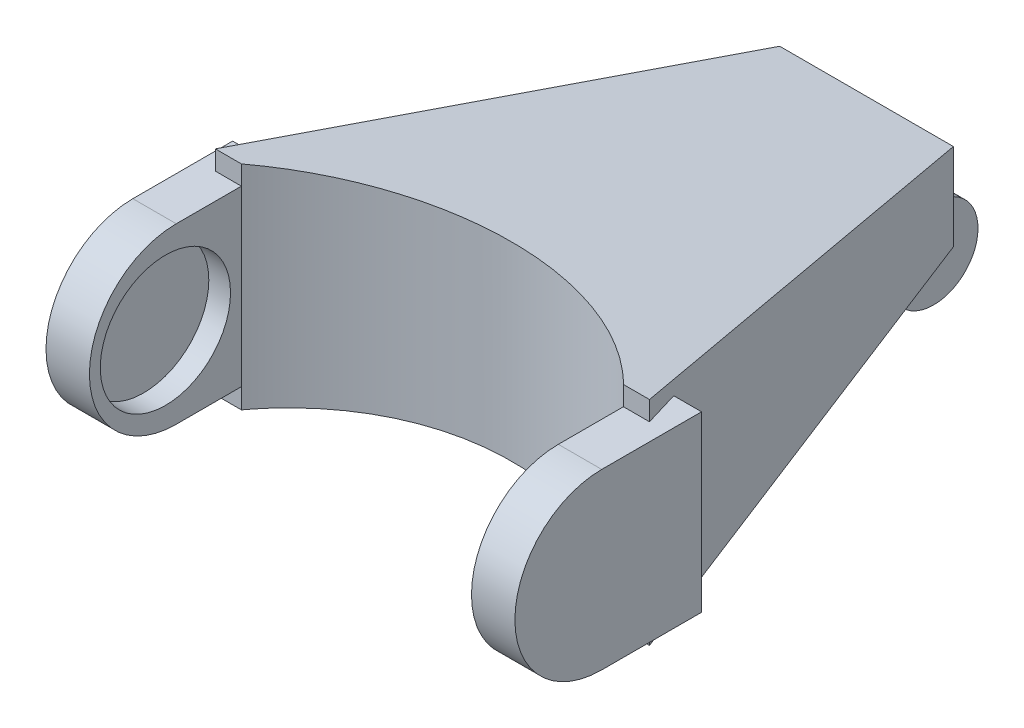
ISO-10303-21;
HEADER;
FILE_DESCRIPTION(('STEP AP214'),'2;1');
FILE_NAME('part.step','',(''),(''),'','','');
FILE_SCHEMA(('AUTOMOTIVE_DESIGN { 1 0 10303 214 1 1 1 1 }'));
ENDSEC;
DATA;
#1=APPLICATION_CONTEXT('core data for automotive mechanical design processes');
#2=APPLICATION_PROTOCOL_DEFINITION('international standard','automotive_design',2000,#1);
#3=PRODUCT_CONTEXT('',#1,'mechanical');
#4=PRODUCT('Part','Part','',(#3));
#5=PRODUCT_RELATED_PRODUCT_CATEGORY('part','',(#4));
#6=PRODUCT_DEFINITION_FORMATION('','',#4);
#7=PRODUCT_DEFINITION_CONTEXT('part definition',#1,'design');
#8=PRODUCT_DEFINITION('design','',#6,#7);
#9=PRODUCT_DEFINITION_SHAPE('','',#8);
#10=(LENGTH_UNIT() NAMED_UNIT(*) SI_UNIT(.MILLI.,.METRE.));
#11=(NAMED_UNIT(*) PLANE_ANGLE_UNIT() SI_UNIT($,.RADIAN.));
#12=(NAMED_UNIT(*) SI_UNIT($,.STERADIAN.) SOLID_ANGLE_UNIT());
#13=UNCERTAINTY_MEASURE_WITH_UNIT(LENGTH_MEASURE(1.E-05),#10,'distance_accuracy_value','');
#14=(GEOMETRIC_REPRESENTATION_CONTEXT(3) GLOBAL_UNCERTAINTY_ASSIGNED_CONTEXT((#13)) GLOBAL_UNIT_ASSIGNED_CONTEXT((#10,
#11,#12)) REPRESENTATION_CONTEXT('',''));
#15=CARTESIAN_POINT('',(0.,0.,0.));
#16=DIRECTION('',(0.,0.,1.));
#17=DIRECTION('',(1.,0.,0.));
#18=AXIS2_PLACEMENT_3D('',#15,#16,#17);
#19=CARTESIAN_POINT('',(-25.,30.,-10.));
#20=DIRECTION('',(0.,0.,-1.));
#21=DIRECTION('',(-1.,0.,0.));
#22=AXIS2_PLACEMENT_3D('',#19,#20,#21);
#23=PLANE('',#22);
#24=DIRECTION('',(0.,1.,0.));
#25=VECTOR('',#24,1.);
#26=CARTESIAN_POINT('',(22.,0.26731497007778,-9.99999999999983));
#27=LINE('',#26,#25);
#28=CARTESIAN_POINT('',(22.,25.0467731044899,-9.99999999999983));
#29=VERTEX_POINT('',#28);
#30=CARTESIAN_POINT('',(22.,27.2673149700778,-9.99999999999983));
#31=VERTEX_POINT('',#30);
#32=EDGE_CURVE('E326',#29,#31,#27,.T.);
#33=ORIENTED_EDGE('',*,*,#32,.F.);
#34=DIRECTION('',(1.,0.,0.));
#35=VECTOR('',#34,1.);
#36=CARTESIAN_POINT('',(-25.,25.0467731044898,-10.));
#37=LINE('',#36,#35);
#38=CARTESIAN_POINT('',(25.,25.0467731044899,-10.));
#39=VERTEX_POINT('',#38);
#40=EDGE_CURVE('E219',#29,#39,#37,.T.);
#41=ORIENTED_EDGE('',*,*,#40,.T.);
#42=DIRECTION('',(0.,-1.,0.));
#43=VECTOR('',#42,1.);
#44=CARTESIAN_POINT('',(25.,30.,-10.));
#45=LINE('',#44,#43);
#46=CARTESIAN_POINT('',(25.,27.2673149700778,-9.99999999999982));
#47=VERTEX_POINT('',#46);
#48=EDGE_CURVE('E360',#47,#39,#45,.T.);
#49=ORIENTED_EDGE('',*,*,#48,.F.);
#50=DIRECTION('',(-1.,0.,0.));
#51=VECTOR('',#50,1.);
#52=CARTESIAN_POINT('',(25.,27.2673149700778,-9.99999999999982));
#53=LINE('',#52,#51);
#54=EDGE_CURVE('E334',#47,#31,#53,.T.);
#55=ORIENTED_EDGE('',*,*,#54,.T.);
#56=EDGE_LOOP('',(#33,#41,#49,#55));
#57=FACE_BOUND('',#56,.T.);
#58=ADVANCED_FACE('F42',(#57),#23,.F.);
#59=DIRECTION('',(1.,0.,0.));
#60=VECTOR('',#59,1.);
#61=CARTESIAN_POINT('',(-25.,5.04677310448987,-10.));
#62=LINE('',#61,#60);
#63=CARTESIAN_POINT('',(-25.,5.04677310448987,-10.));
#64=VERTEX_POINT('',#63);
#65=CARTESIAN_POINT('',(-22.,5.04677310448986,-9.99999999999999));
#66=VERTEX_POINT('',#65);
#67=EDGE_CURVE('E297',#64,#66,#62,.T.);
#68=ORIENTED_EDGE('',*,*,#67,.F.);
#69=DIRECTION('',(0.,-1.,0.));
#70=VECTOR('',#69,1.);
#71=CARTESIAN_POINT('',(-25.,30.,-10.));
#72=LINE('',#71,#70);
#73=CARTESIAN_POINT('',(-25.,2.73268502992221,-10.));
#74=VERTEX_POINT('',#73);
#75=EDGE_CURVE('E349',#64,#74,#72,.T.);
#76=ORIENTED_EDGE('',*,*,#75,.T.);
#77=DIRECTION('',(-1.,0.,0.));
#78=VECTOR('',#77,1.);
#79=CARTESIAN_POINT('',(25.,2.73268502992221,-9.99999999999982));
#80=LINE('',#79,#78);
#81=CARTESIAN_POINT('',(-22.,2.73268502992221,-9.99999999999999));
#82=VERTEX_POINT('',#81);
#83=EDGE_CURVE('E333',#82,#74,#80,.T.);
#84=ORIENTED_EDGE('',*,*,#83,.F.);
#85=DIRECTION('',(0.,1.,0.));
#86=VECTOR('',#85,1.);
#87=CARTESIAN_POINT('',(-22.,0.26731497007778,-9.99999999999999));
#88=LINE('',#87,#86);
#89=EDGE_CURVE('E327',#82,#66,#88,.T.);
#90=ORIENTED_EDGE('',*,*,#89,.T.);
#91=EDGE_LOOP('',(#68,#76,#84,#90));
#92=FACE_BOUND('',#91,.T.);
#93=ADVANCED_FACE('F457',(#92),#23,.F.);
#94=DIRECTION('',(-1.,0.,0.));
#95=VECTOR('',#94,1.);
#96=CARTESIAN_POINT('',(-25.,25.0467731044899,-10.));
#97=LINE('',#96,#95);
#98=CARTESIAN_POINT('',(-22.,25.0467731044899,-9.99999999999999));
#99=VERTEX_POINT('',#98);
#100=CARTESIAN_POINT('',(-25.,25.0467731044899,-10.));
#101=VERTEX_POINT('',#100);
#102=EDGE_CURVE('E293',#99,#101,#97,.T.);
#103=ORIENTED_EDGE('',*,*,#102,.F.);
#104=CARTESIAN_POINT('',(-22.,27.2673149700778,-9.99999999999999));
#105=VERTEX_POINT('',#104);
#106=EDGE_CURVE('E320',#99,#105,#88,.T.);
#107=ORIENTED_EDGE('',*,*,#106,.T.);
#108=CARTESIAN_POINT('',(-25.,27.2673149700778,-10.));
#109=VERTEX_POINT('',#108);
#110=EDGE_CURVE('E338',#105,#109,#53,.T.);
#111=ORIENTED_EDGE('',*,*,#110,.T.);
#112=EDGE_CURVE('E350',#109,#101,#72,.T.);
#113=ORIENTED_EDGE('',*,*,#112,.T.);
#114=EDGE_LOOP('',(#103,#107,#111,#113));
#115=FACE_BOUND('',#114,.T.);
#116=ADVANCED_FACE('F423',(#115),#23,.F.);
#117=CARTESIAN_POINT('',(-10.,30.,-60.));
#118=DIRECTION('',(0.957826285221151,0.,0.287347885566346));
#119=DIRECTION('',(0.287347885566346,0.,-0.957826285221151));
#120=AXIS2_PLACEMENT_3D('',#117,#118,#119);
#121=PLANE('',#120);
#122=DIRECTION('',(-0.287347885566346,0.,0.957826285221151));
#123=VECTOR('',#122,1.);
#124=CARTESIAN_POINT('',(-10.,5.04677310448988,-60.));
#125=LINE('',#124,#123);
#126=CARTESIAN_POINT('',(-23.8020728035436,5.04677310448987,-13.9930906548547));
#127=VERTEX_POINT('',#126);
#128=EDGE_CURVE('E66',#127,#64,#125,.T.);
#129=ORIENTED_EDGE('',*,*,#128,.F.);
#130=DIRECTION('',(0.,-1.,0.));
#131=VECTOR('',#130,1.);
#132=CARTESIAN_POINT('',(-23.8020728035436,30.,-13.9930906548547));
#133=LINE('',#132,#131);
#134=CARTESIAN_POINT('',(-23.8020728035436,25.0467731044899,-13.9930906548547));
#135=VERTEX_POINT('',#134);
#136=EDGE_CURVE('E51',#135,#127,#133,.T.);
#137=ORIENTED_EDGE('',*,*,#136,.F.);
#138=DIRECTION('',(0.287347885566346,0.,-0.957826285221151));
#139=VECTOR('',#138,1.);
#140=CARTESIAN_POINT('',(-10.,25.0467731044898,-60.));
#141=LINE('',#140,#139);
#142=EDGE_CURVE('E290',#101,#135,#141,.T.);
#143=ORIENTED_EDGE('',*,*,#142,.F.);
#144=ORIENTED_EDGE('',*,*,#112,.F.);
#145=DIRECTION('',(0.28460314062852,-0.137886710961386,-0.948677135428399));
#146=VECTOR('',#145,1.);
#147=CARTESIAN_POINT('',(-10.3924299099055,20.1901274505975,-58.6919003003151));
#148=LINE('',#147,#146);
#149=CARTESIAN_POINT('',(-10.,20.,-60.));
#150=VERTEX_POINT('',#149);
#151=EDGE_CURVE('E366',#109,#150,#148,.T.);
#152=ORIENTED_EDGE('',*,*,#151,.T.);
#153=DIRECTION('',(0.,-1.,0.));
#154=VECTOR('',#153,1.);
#155=CARTESIAN_POINT('',(-10.,30.,-60.));
#156=LINE('',#155,#154);
#157=CARTESIAN_POINT('',(-10.,15.,-60.));
#158=VERTEX_POINT('',#157);
#159=EDGE_CURVE('E353',#150,#158,#156,.T.);
#160=ORIENTED_EDGE('',*,*,#159,.T.);
#161=DIRECTION('',(0.,-1.,0.));
#162=VECTOR('',#161,1.);
#163=CARTESIAN_POINT('',(-10.,15.,-60.));
#164=LINE('',#163,#162);
#165=CARTESIAN_POINT('',(-9.99999999999999,10.,-60.));
#166=VERTEX_POINT('',#165);
#167=EDGE_CURVE('E300',#158,#166,#164,.T.);
#168=ORIENTED_EDGE('',*,*,#167,.T.);
#169=DIRECTION('',(-0.28460314062852,-0.137886710961386,0.9486771354284));
#170=VECTOR('',#169,1.);
#171=CARTESIAN_POINT('',(-9.21514018018905,10.380254901195,-62.6161993993698));
#172=LINE('',#171,#170);
#173=EDGE_CURVE('E363',#166,#74,#172,.T.);
#174=ORIENTED_EDGE('',*,*,#173,.T.);
#175=ORIENTED_EDGE('',*,*,#75,.F.);
#176=EDGE_LOOP('',(#129,#137,#143,#144,#152,#160,#168,#174,#175));
#177=FACE_BOUND('',#176,.T.);
#178=ADVANCED_FACE('F421',(#177),#121,.F.);
#179=CARTESIAN_POINT('',(-10.,30.,-60.));
#180=DIRECTION('',(0.,0.,1.));
#181=DIRECTION('',(1.,0.,0.));
#182=AXIS2_PLACEMENT_3D('',#179,#180,#181);
#183=PLANE('',#182);
#184=DIRECTION('',(-1.,0.,0.));
#185=VECTOR('',#184,1.);
#186=CARTESIAN_POINT('',(10.,15.,-59.9999999999999));
#187=LINE('',#186,#185);
#188=CARTESIAN_POINT('',(10.,15.,-59.9999999999999));
#189=VERTEX_POINT('',#188);
#190=EDGE_CURVE('E308',#189,#158,#187,.T.);
#191=ORIENTED_EDGE('',*,*,#190,.T.);
#192=ORIENTED_EDGE('',*,*,#159,.F.);
#193=DIRECTION('',(-1.,0.,0.));
#194=VECTOR('',#193,1.);
#195=CARTESIAN_POINT('',(25.0000000000002,20.,-59.9999999999999));
#196=LINE('',#195,#194);
#197=CARTESIAN_POINT('',(10.,20.,-59.9999999999999));
#198=VERTEX_POINT('',#197);
#199=EDGE_CURVE('E339',#198,#150,#196,.T.);
#200=ORIENTED_EDGE('',*,*,#199,.F.);
#201=DIRECTION('',(0.,-1.,0.));
#202=VECTOR('',#201,1.);
#203=CARTESIAN_POINT('',(10.,30.,-60.));
#204=LINE('',#203,#202);
#205=EDGE_CURVE('E356',#198,#189,#204,.T.);
#206=ORIENTED_EDGE('',*,*,#205,.T.);
#207=EDGE_LOOP('',(#191,#192,#200,#206));
#208=FACE_BOUND('',#207,.T.);
#209=ADVANCED_FACE('F433',(#208),#183,.F.);
#210=CARTESIAN_POINT('',(25.0000000000002,10.,-59.9999999999999));
#211=DIRECTION('',(0.,0.989601692063751,0.143834943822984));
#212=DIRECTION('',(0.,-0.143834943822984,0.989601692063751));
#213=AXIS2_PLACEMENT_3D('',#210,#211,#212);
#214=PLANE('',#213);
#215=DIRECTION('',(0.,-0.143834943822984,0.989601692063751));
#216=VECTOR('',#215,1.);
#217=CARTESIAN_POINT('',(10.,10.,-59.9999999999999));
#218=LINE('',#217,#216);
#219=CARTESIAN_POINT('',(10.,10.,-59.9999999999999));
#220=VERTEX_POINT('',#219);
#221=CARTESIAN_POINT('',(9.99999999999998,8.96081172504753,-52.8502598330249));
#222=VERTEX_POINT('',#221);
#223=EDGE_CURVE('E303',#220,#222,#218,.T.);
#224=ORIENTED_EDGE('',*,*,#223,.F.);
#225=DIRECTION('',(-0.28460314062852,0.137886710961386,-0.9486771354284));
#226=VECTOR('',#225,1.);
#227=CARTESIAN_POINT('',(9.21514018018905,10.380254901195,-62.6161993993698));
#228=LINE('',#227,#226);
#229=CARTESIAN_POINT('',(25.,2.73268502992221,-9.99999999999982));
#230=VERTEX_POINT('',#229);
#231=EDGE_CURVE('E337',#230,#220,#228,.T.);
#232=ORIENTED_EDGE('',*,*,#231,.F.);
#233=CARTESIAN_POINT('',(22.,2.73268502992221,-9.99999999999983));
#234=VERTEX_POINT('',#233);
#235=EDGE_CURVE('E341',#230,#234,#80,.T.);
#236=ORIENTED_EDGE('',*,*,#235,.T.);
#237=CARTESIAN_POINT('',(0.,-0.46493355691203,12.0000000000002));
#238=DIRECTION('',(0.,0.989601692063751,0.143834943822984));
#239=DIRECTION('',(0.,0.143834943822984,-0.989601692063751));
#240=AXIS2_PLACEMENT_3D('',#237,#238,#239);
#241=ELLIPSE('',#240,31.4396171931806,31.1126983722082);
#242=EDGE_CURVE('E324',#234,#82,#241,.T.);
#243=ORIENTED_EDGE('',*,*,#242,.T.);
#244=ORIENTED_EDGE('',*,*,#83,.T.);
#245=ORIENTED_EDGE('',*,*,#173,.F.);
#246=DIRECTION('',(0.,-0.143834943822984,0.989601692063751));
#247=VECTOR('',#246,1.);
#248=CARTESIAN_POINT('',(-9.99999999999999,10.,-60.));
#249=LINE('',#248,#247);
#250=CARTESIAN_POINT('',(-10.,8.96081172504752,-52.8502598330249));
#251=VERTEX_POINT('',#250);
#252=EDGE_CURVE('E311',#166,#251,#249,.T.);
#253=ORIENTED_EDGE('',*,*,#252,.T.);
#254=DIRECTION('',(-1.,0.,0.));
#255=VECTOR('',#254,1.);
#256=CARTESIAN_POINT('',(9.99999999999998,8.96081172504753,-52.8502598330249));
#257=LINE('',#256,#255);
#258=EDGE_CURVE('E317',#222,#251,#257,.T.);
#259=ORIENTED_EDGE('',*,*,#258,.F.);
#260=EDGE_LOOP('',(#224,#232,#236,#243,#244,#245,#253,#259));
#261=FACE_BOUND('',#260,.T.);
#262=ADVANCED_FACE('F449',(#261),#214,.F.);
#263=CARTESIAN_POINT('',(25.,5.04677310448991,-10.));
#264=VERTEX_POINT('',#263);
#265=EDGE_CURVE('E359',#264,#230,#45,.T.);
#266=ORIENTED_EDGE('',*,*,#265,.F.);
#267=DIRECTION('',(-1.,0.,0.));
#268=VECTOR('',#267,1.);
#269=CARTESIAN_POINT('',(-25.,5.04677310448982,-10.));
#270=LINE('',#269,#268);
#271=CARTESIAN_POINT('',(22.0000000000001,5.0467731044899,-9.99999999999974));
#272=VERTEX_POINT('',#271);
#273=EDGE_CURVE('E249',#264,#272,#270,.T.);
#274=ORIENTED_EDGE('',*,*,#273,.T.);
#275=EDGE_CURVE('E321',#234,#272,#27,.T.);
#276=ORIENTED_EDGE('',*,*,#275,.F.);
#277=ORIENTED_EDGE('',*,*,#235,.F.);
#278=EDGE_LOOP('',(#266,#274,#276,#277));
#279=FACE_BOUND('',#278,.T.);
#280=ADVANCED_FACE('F464',(#279),#23,.F.);
#281=CARTESIAN_POINT('',(10.,30.,-60.));
#282=DIRECTION('',(-0.957826285221151,0.,0.287347885566346));
#283=DIRECTION('',(0.287347885566346,0.,0.957826285221151));
#284=AXIS2_PLACEMENT_3D('',#281,#282,#283);
#285=PLANE('',#284);
#286=ORIENTED_EDGE('',*,*,#48,.T.);
#287=DIRECTION('',(-0.287347885566346,0.,-0.957826285221151));
#288=VECTOR('',#287,1.);
#289=CARTESIAN_POINT('',(10.,25.0467731044899,-60.));
#290=LINE('',#289,#288);
#291=CARTESIAN_POINT('',(23.8020728035436,25.0467731044899,-13.9930906548546));
#292=VERTEX_POINT('',#291);
#293=EDGE_CURVE('E252',#39,#292,#290,.T.);
#294=ORIENTED_EDGE('',*,*,#293,.T.);
#295=DIRECTION('',(0.,-1.,0.));
#296=VECTOR('',#295,1.);
#297=CARTESIAN_POINT('',(23.8020728035436,30.,-13.9930906548546));
#298=LINE('',#297,#296);
#299=CARTESIAN_POINT('',(23.8020728035436,5.04677310448991,-13.9930906548546));
#300=VERTEX_POINT('',#299);
#301=EDGE_CURVE('E11',#292,#300,#298,.T.);
#302=ORIENTED_EDGE('',*,*,#301,.T.);
#303=DIRECTION('',(0.287347885566346,0.,0.957826285221151));
#304=VECTOR('',#303,1.);
#305=CARTESIAN_POINT('',(10.,5.04677310448988,-60.));
#306=LINE('',#305,#304);
#307=EDGE_CURVE('E246',#300,#264,#306,.T.);
#308=ORIENTED_EDGE('',*,*,#307,.T.);
#309=ORIENTED_EDGE('',*,*,#265,.T.);
#310=ORIENTED_EDGE('',*,*,#231,.T.);
#311=DIRECTION('',(0.,-1.,0.));
#312=VECTOR('',#311,1.);
#313=CARTESIAN_POINT('',(10.,15.,-59.9999999999999));
#314=LINE('',#313,#312);
#315=EDGE_CURVE('E301',#189,#220,#314,.T.);
#316=ORIENTED_EDGE('',*,*,#315,.F.);
#317=ORIENTED_EDGE('',*,*,#205,.F.);
#318=DIRECTION('',(0.28460314062852,0.137886710961386,0.9486771354284));
#319=VECTOR('',#318,1.);
#320=CARTESIAN_POINT('',(10.3924299099055,20.1901274505975,-58.6919003003151));
#321=LINE('',#320,#319);
#322=EDGE_CURVE('E346',#198,#47,#321,.T.);
#323=ORIENTED_EDGE('',*,*,#322,.T.);
#324=EDGE_LOOP('',(#286,#294,#302,#308,#309,#310,#316,#317,#323));
#325=FACE_BOUND('',#324,.T.);
#326=ADVANCED_FACE('F443',(#325),#285,.F.);
#327=CARTESIAN_POINT('',(25.,27.2673149700778,-9.99999999999982));
#328=DIRECTION('',(0.,-0.989601692063751,0.143834943822984));
#329=DIRECTION('',(0.,-0.143834943822984,-0.989601692063751));
#330=AXIS2_PLACEMENT_3D('',#327,#328,#329);
#331=PLANE('',#330);
#332=ORIENTED_EDGE('',*,*,#110,.F.);
#333=CARTESIAN_POINT('',(0.,30.464933556912,12.0000000000002));
#334=DIRECTION('',(0.,-0.989601692063751,0.143834943822984));
#335=DIRECTION('',(0.,0.143834943822984,0.989601692063751));
#336=AXIS2_PLACEMENT_3D('',#333,#334,#335);
#337=ELLIPSE('',#336,31.4396171931806,31.1126983722082);
#338=EDGE_CURVE('E369',#105,#31,#337,.T.);
#339=ORIENTED_EDGE('',*,*,#338,.T.);
#340=ORIENTED_EDGE('',*,*,#54,.F.);
#341=ORIENTED_EDGE('',*,*,#322,.F.);
#342=ORIENTED_EDGE('',*,*,#199,.T.);
#343=ORIENTED_EDGE('',*,*,#151,.F.);
#344=EDGE_LOOP('',(#332,#339,#340,#341,#342,#343));
#345=FACE_BOUND('',#344,.T.);
#346=ADVANCED_FACE('F429',(#345),#331,.F.);
#347=CARTESIAN_POINT('',(0.,0.26731497007778,12.0000000000002));
#348=DIRECTION('',(0.,1.,0.));
#349=DIRECTION('',(0.,0.,1.));
#350=AXIS2_PLACEMENT_3D('',#347,#348,#349);
#351=CYLINDRICAL_SURFACE('',#350,31.1126983722082);
#352=ORIENTED_EDGE('',*,*,#275,.T.);
#353=EDGE_CURVE('E325',#272,#29,#27,.T.);
#354=ORIENTED_EDGE('',*,*,#353,.T.);
#355=ORIENTED_EDGE('',*,*,#32,.T.);
#356=ORIENTED_EDGE('',*,*,#338,.F.);
#357=ORIENTED_EDGE('',*,*,#106,.F.);
#358=EDGE_CURVE('E330',#66,#99,#88,.T.);
#359=ORIENTED_EDGE('',*,*,#358,.F.);
#360=ORIENTED_EDGE('',*,*,#89,.F.);
#361=ORIENTED_EDGE('',*,*,#242,.F.);
#362=EDGE_LOOP('',(#352,#354,#355,#356,#357,#359,#360,#361));
#363=FACE_BOUND('',#362,.T.);
#364=ADVANCED_FACE('F460',(#363),#351,.F.);
#365=CARTESIAN_POINT('',(10.,10.4321910432467,-57.7328642628421));
#366=DIRECTION('',(-1.,0.,0.));
#367=DIRECTION('',(0.,0.,1.));
#368=AXIS2_PLACEMENT_3D('',#365,#366,#367);
#369=CYLINDRICAL_SURFACE('',#368,5.09948851514488);
#370=CARTESIAN_POINT('',(-10.,10.4321910432466,-57.7328642628421));
#371=DIRECTION('',(1.,0.,0.));
#372=DIRECTION('',(0.,0.,1.));
#373=AXIS2_PLACEMENT_3D('',#370,#371,#372);
#374=CIRCLE('',#373,5.09948851514488);
#375=EDGE_CURVE('E304',#251,#158,#374,.T.);
#376=ORIENTED_EDGE('',*,*,#375,.T.);
#377=ORIENTED_EDGE('',*,*,#190,.F.);
#378=CARTESIAN_POINT('',(10.,10.4321910432467,-57.7328642628421));
#379=DIRECTION('',(1.,0.,0.));
#380=DIRECTION('',(0.,0.,1.));
#381=AXIS2_PLACEMENT_3D('',#378,#379,#380);
#382=CIRCLE('',#381,5.09948851514488);
#383=EDGE_CURVE('E306',#222,#189,#382,.T.);
#384=ORIENTED_EDGE('',*,*,#383,.F.);
#385=ORIENTED_EDGE('',*,*,#258,.T.);
#386=EDGE_LOOP('',(#376,#377,#384,#385));
#387=FACE_BOUND('',#386,.T.);
#388=ADVANCED_FACE('F439',(#387),#369,.T.);
#389=CARTESIAN_POINT('',(10.,10.4321910432467,-57.7328642628421));
#390=DIRECTION('',(-1.,0.,0.));
#391=DIRECTION('',(0.,0.,1.));
#392=AXIS2_PLACEMENT_3D('',#389,#390,#391);
#393=PLANE('',#392);
#394=ORIENTED_EDGE('',*,*,#315,.T.);
#395=ORIENTED_EDGE('',*,*,#223,.T.);
#396=ORIENTED_EDGE('',*,*,#383,.T.);
#397=EDGE_LOOP('',(#394,#395,#396));
#398=FACE_BOUND('',#397,.T.);
#399=ADVANCED_FACE('F447',(#398),#393,.F.);
#400=CARTESIAN_POINT('',(-10.,10.4321910432466,-57.7328642628421));
#401=DIRECTION('',(-1.,0.,0.));
#402=DIRECTION('',(0.,0.,1.));
#403=AXIS2_PLACEMENT_3D('',#400,#401,#402);
#404=PLANE('',#403);
#405=ORIENTED_EDGE('',*,*,#167,.F.);
#406=ORIENTED_EDGE('',*,*,#375,.F.);
#407=ORIENTED_EDGE('',*,*,#252,.F.);
#408=EDGE_LOOP('',(#405,#406,#407));
#409=FACE_BOUND('',#408,.T.);
#410=ADVANCED_FACE('F454',(#409),#404,.T.);
#411=CARTESIAN_POINT('',(-27.,25.0467731044899,-13.9930906548547));
#412=DIRECTION('',(0.,0.,1.));
#413=DIRECTION('',(1.,0.,0.));
#414=AXIS2_PLACEMENT_3D('',#411,#412,#413);
#415=PLANE('',#414);
#416=DIRECTION('',(1.,0.,0.));
#417=VECTOR('',#416,1.);
#418=CARTESIAN_POINT('',(-27.,25.0467731044899,-13.9930906548547));
#419=LINE('',#418,#417);
#420=CARTESIAN_POINT('',(-27.,25.0467731044899,-13.9930906548547));
#421=VERTEX_POINT('',#420);
#422=EDGE_CURVE('E279',#421,#135,#419,.T.);
#423=ORIENTED_EDGE('',*,*,#422,.T.);
#424=ORIENTED_EDGE('',*,*,#136,.T.);
#425=DIRECTION('',(1.,0.,0.));
#426=VECTOR('',#425,1.);
#427=CARTESIAN_POINT('',(-27.,5.04677310448987,-13.9930906548547));
#428=LINE('',#427,#426);
#429=CARTESIAN_POINT('',(-27.,5.04677310448987,-13.9930906548547));
#430=VERTEX_POINT('',#429);
#431=EDGE_CURVE('E287',#430,#127,#428,.T.);
#432=ORIENTED_EDGE('',*,*,#431,.F.);
#433=DIRECTION('',(0.,-1.,0.));
#434=VECTOR('',#433,1.);
#435=CARTESIAN_POINT('',(-27.,25.0467731044899,-13.9930906548547));
#436=LINE('',#435,#434);
#437=EDGE_CURVE('E270',#421,#430,#436,.T.);
#438=ORIENTED_EDGE('',*,*,#437,.F.);
#439=EDGE_LOOP('',(#423,#424,#432,#438));
#440=FACE_BOUND('',#439,.T.);
#441=ADVANCED_FACE('F406',(#440),#415,.F.);
#442=CARTESIAN_POINT('',(-27.,5.04677310448987,-9.99309065485475));
#443=DIRECTION('',(0.,1.,0.));
#444=DIRECTION('',(0.,0.,1.));
#445=AXIS2_PLACEMENT_3D('',#442,#443,#444);
#446=PLANE('',#445);
#447=ORIENTED_EDGE('',*,*,#128,.T.);
#448=ORIENTED_EDGE('',*,*,#67,.T.);
#449=DIRECTION('',(0.,0.,1.));
#450=VECTOR('',#449,1.);
#451=CARTESIAN_POINT('',(-22.,5.04677310448987,-13.9930906548547));
#452=LINE('',#451,#450);
#453=CARTESIAN_POINT('',(-22.,5.04677310448986,-2.49999999999999));
#454=VERTEX_POINT('',#453);
#455=EDGE_CURVE('E260',#66,#454,#452,.T.);
#456=ORIENTED_EDGE('',*,*,#455,.T.);
#457=DIRECTION('',(1.,0.,0.));
#458=VECTOR('',#457,1.);
#459=CARTESIAN_POINT('',(-27.,5.04677310448986,-2.50000000000001));
#460=LINE('',#459,#458);
#461=CARTESIAN_POINT('',(-27.,5.04677310448986,-2.50000000000001));
#462=VERTEX_POINT('',#461);
#463=EDGE_CURVE('E284',#462,#454,#460,.T.);
#464=ORIENTED_EDGE('',*,*,#463,.F.);
#465=DIRECTION('',(0.,0.,1.));
#466=VECTOR('',#465,1.);
#467=CARTESIAN_POINT('',(-27.,5.04677310448987,-13.9930906548547));
#468=LINE('',#467,#466);
#469=EDGE_CURVE('E273',#430,#462,#468,.T.);
#470=ORIENTED_EDGE('',*,*,#469,.F.);
#471=ORIENTED_EDGE('',*,*,#431,.T.);
#472=EDGE_LOOP('',(#447,#448,#456,#464,#470,#471));
#473=FACE_BOUND('',#472,.T.);
#474=ADVANCED_FACE('F410',(#473),#446,.F.);
#475=CARTESIAN_POINT('',(-27.,25.0467731044899,-9.99309065485475));
#476=DIRECTION('',(0.,-1.,0.));
#477=DIRECTION('',(0.,0.,-1.));
#478=AXIS2_PLACEMENT_3D('',#475,#476,#477);
#479=PLANE('',#478);
#480=DIRECTION('',(0.,0.,-1.));
#481=VECTOR('',#480,1.);
#482=CARTESIAN_POINT('',(-22.,25.0467731044899,-2.49999999999999));
#483=LINE('',#482,#481);
#484=CARTESIAN_POINT('',(-22.,25.0467731044899,-2.49999999999999));
#485=VERTEX_POINT('',#484);
#486=EDGE_CURVE('E267',#485,#99,#483,.T.);
#487=ORIENTED_EDGE('',*,*,#486,.T.);
#488=ORIENTED_EDGE('',*,*,#102,.T.);
#489=ORIENTED_EDGE('',*,*,#142,.T.);
#490=ORIENTED_EDGE('',*,*,#422,.F.);
#491=DIRECTION('',(0.,0.,-1.));
#492=VECTOR('',#491,1.);
#493=CARTESIAN_POINT('',(-27.,25.0467731044899,-2.50000000000001));
#494=LINE('',#493,#492);
#495=CARTESIAN_POINT('',(-27.,25.0467731044899,-2.50000000000001));
#496=VERTEX_POINT('',#495);
#497=EDGE_CURVE('E277',#496,#421,#494,.T.);
#498=ORIENTED_EDGE('',*,*,#497,.F.);
#499=DIRECTION('',(1.,0.,0.));
#500=VECTOR('',#499,1.);
#501=CARTESIAN_POINT('',(-27.,25.0467731044899,-2.50000000000001));
#502=LINE('',#501,#500);
#503=EDGE_CURVE('E282',#496,#485,#502,.T.);
#504=ORIENTED_EDGE('',*,*,#503,.T.);
#505=EDGE_LOOP('',(#487,#488,#489,#490,#498,#504));
#506=FACE_BOUND('',#505,.T.);
#507=ADVANCED_FACE('F418',(#506),#479,.F.);
#508=CARTESIAN_POINT('',(-22.,15.0467731044899,-2.49999999999999));
#509=DIRECTION('',(-1.,0.,0.));
#510=DIRECTION('',(0.,0.,1.));
#511=AXIS2_PLACEMENT_3D('',#508,#509,#510);
#512=PLANE('',#511);
#513=CARTESIAN_POINT('',(-22.,15.0467731044899,-1.24999999999999));
#514=DIRECTION('',(1.,0.,0.));
#515=DIRECTION('',(0.,0.,-1.));
#516=AXIS2_PLACEMENT_3D('',#513,#514,#515);
#517=CIRCLE('',#516,7.5);
#518=CARTESIAN_POINT('',(-22.,15.0467731044899,-8.74999999999999));
#519=VERTEX_POINT('',#518);
#520=EDGE_CURVE('E256',#519,#519,#517,.T.);
#521=ORIENTED_EDGE('',*,*,#520,.F.);
#522=EDGE_LOOP('',(#521));
#523=FACE_BOUND('',#522,.T.);
#524=ORIENTED_EDGE('',*,*,#455,.F.);
#525=ORIENTED_EDGE('',*,*,#358,.T.);
#526=ORIENTED_EDGE('',*,*,#486,.F.);
#527=CARTESIAN_POINT('',(-22.,15.0467731044899,-2.49999999999999));
#528=DIRECTION('',(-1.,0.,0.));
#529=DIRECTION('',(0.,0.,1.));
#530=AXIS2_PLACEMENT_3D('',#527,#528,#529);
#531=CIRCLE('',#530,10.);
#532=EDGE_CURVE('E264',#454,#485,#531,.T.);
#533=ORIENTED_EDGE('',*,*,#532,.F.);
#534=EDGE_LOOP('',(#524,#525,#526,#533));
#535=FACE_BOUND('',#534,.T.);
#536=ADVANCED_FACE('F529',(#523,#535),#512,.F.);
#537=CARTESIAN_POINT('',(-27.,15.0467731044899,-2.50000000000001));
#538=DIRECTION('',(1.,0.,0.));
#539=DIRECTION('',(0.,0.,-1.));
#540=AXIS2_PLACEMENT_3D('',#537,#538,#539);
#541=CYLINDRICAL_SURFACE('',#540,10.);
#542=ORIENTED_EDGE('',*,*,#463,.T.);
#543=ORIENTED_EDGE('',*,*,#532,.T.);
#544=ORIENTED_EDGE('',*,*,#503,.F.);
#545=CARTESIAN_POINT('',(-27.,15.0467731044899,-2.50000000000001));
#546=DIRECTION('',(-1.,0.,0.));
#547=DIRECTION('',(0.,0.,1.));
#548=AXIS2_PLACEMENT_3D('',#545,#546,#547);
#549=CIRCLE('',#548,10.);
#550=EDGE_CURVE('E275',#462,#496,#549,.T.);
#551=ORIENTED_EDGE('',*,*,#550,.F.);
#552=EDGE_LOOP('',(#542,#543,#544,#551));
#553=FACE_BOUND('',#552,.T.);
#554=ADVANCED_FACE('F526',(#553),#541,.T.);
#555=CARTESIAN_POINT('',(-27.,15.0467731044899,-2.50000000000001));
#556=DIRECTION('',(-1.,0.,0.));
#557=DIRECTION('',(0.,0.,1.));
#558=AXIS2_PLACEMENT_3D('',#555,#556,#557);
#559=PLANE('',#558);
#560=ORIENTED_EDGE('',*,*,#437,.T.);
#561=ORIENTED_EDGE('',*,*,#469,.T.);
#562=ORIENTED_EDGE('',*,*,#550,.T.);
#563=ORIENTED_EDGE('',*,*,#497,.T.);
#564=EDGE_LOOP('',(#560,#561,#562,#563));
#565=FACE_BOUND('',#564,.T.);
#566=ADVANCED_FACE('F414',(#565),#559,.T.);
#567=CARTESIAN_POINT('',(-24.5,15.0467731044899,-1.25));
#568=DIRECTION('',(1.,0.,0.));
#569=DIRECTION('',(0.,0.,-1.));
#570=AXIS2_PLACEMENT_3D('',#567,#568,#569);
#571=CYLINDRICAL_SURFACE('',#570,7.5);
#572=CARTESIAN_POINT('',(-24.5,15.0467731044899,-1.25));
#573=DIRECTION('',(1.,0.,0.));
#574=DIRECTION('',(0.,0.,-1.));
#575=AXIS2_PLACEMENT_3D('',#572,#573,#574);
#576=CIRCLE('',#575,7.5);
#577=CARTESIAN_POINT('',(-24.5,15.0467731044899,-8.75));
#578=VERTEX_POINT('',#577);
#579=EDGE_CURVE('E257',#578,#578,#576,.T.);
#580=ORIENTED_EDGE('',*,*,#579,.F.);
#581=EDGE_LOOP('',(#580));
#582=FACE_BOUND('',#581,.T.);
#583=ORIENTED_EDGE('',*,*,#520,.T.);
#584=EDGE_LOOP('',(#583));
#585=FACE_BOUND('',#584,.T.);
#586=ADVANCED_FACE('F535',(#582,#585),#571,.F.);
#587=CARTESIAN_POINT('',(-24.5,15.0467731044899,-1.25));
#588=DIRECTION('',(1.,0.,0.));
#589=DIRECTION('',(0.,0.,-1.));
#590=AXIS2_PLACEMENT_3D('',#587,#588,#589);
#591=PLANE('',#590);
#592=ORIENTED_EDGE('',*,*,#579,.T.);
#593=EDGE_LOOP('',(#592));
#594=FACE_BOUND('',#593,.T.);
#595=ADVANCED_FACE('F541',(#594),#591,.T.);
#596=CARTESIAN_POINT('',(27.0000000000001,25.0467731044899,-13.9930906548546));
#597=DIRECTION('',(0.,0.,-1.));
#598=DIRECTION('',(-1.,0.,0.));
#599=AXIS2_PLACEMENT_3D('',#596,#597,#598);
#600=PLANE('',#599);
#601=ORIENTED_EDGE('',*,*,#301,.F.);
#602=DIRECTION('',(-1.,0.,0.));
#603=VECTOR('',#602,1.);
#604=CARTESIAN_POINT('',(27.0000000000001,25.0467731044899,-13.9930906548546));
#605=LINE('',#604,#603);
#606=CARTESIAN_POINT('',(27.0000000000001,25.0467731044899,-13.9930906548546));
#607=VERTEX_POINT('',#606);
#608=EDGE_CURVE('E214',#607,#292,#605,.T.);
#609=ORIENTED_EDGE('',*,*,#608,.F.);
#610=DIRECTION('',(0.,-1.,0.));
#611=VECTOR('',#610,1.);
#612=CARTESIAN_POINT('',(27.0000000000001,25.0467731044899,-13.9930906548546));
#613=LINE('',#612,#611);
#614=CARTESIAN_POINT('',(27.0000000000001,5.04677310448991,-13.9930906548546));
#615=VERTEX_POINT('',#614);
#616=EDGE_CURVE('E228',#607,#615,#613,.T.);
#617=ORIENTED_EDGE('',*,*,#616,.T.);
#618=DIRECTION('',(-1.,0.,0.));
#619=VECTOR('',#618,1.);
#620=CARTESIAN_POINT('',(27.0000000000001,5.04677310448991,-13.9930906548546));
#621=LINE('',#620,#619);
#622=EDGE_CURVE('E240',#615,#300,#621,.T.);
#623=ORIENTED_EDGE('',*,*,#622,.T.);
#624=EDGE_LOOP('',(#601,#609,#617,#623));
#625=FACE_BOUND('',#624,.T.);
#626=ADVANCED_FACE('F469',(#625),#600,.T.);
#627=CARTESIAN_POINT('',(27.,25.0467731044899,-2.49999999999982));
#628=DIRECTION('',(0.,1.,0.));
#629=DIRECTION('',(-1.,0.,0.));
#630=AXIS2_PLACEMENT_3D('',#627,#628,#629);
#631=PLANE('',#630);
#632=ORIENTED_EDGE('',*,*,#40,.F.);
#633=DIRECTION('',(0.,0.,-1.));
#634=VECTOR('',#633,1.);
#635=CARTESIAN_POINT('',(22.,25.0467731044899,-9.99309065485458));
#636=LINE('',#635,#634);
#637=CARTESIAN_POINT('',(22.,25.0467731044899,-2.49999999999984));
#638=VERTEX_POINT('',#637);
#639=EDGE_CURVE('E58',#638,#29,#636,.T.);
#640=ORIENTED_EDGE('',*,*,#639,.F.);
#641=DIRECTION('',(-1.,0.,0.));
#642=VECTOR('',#641,1.);
#643=CARTESIAN_POINT('',(27.,25.0467731044899,-2.49999999999982));
#644=LINE('',#643,#642);
#645=CARTESIAN_POINT('',(27.,25.0467731044899,-2.49999999999982));
#646=VERTEX_POINT('',#645);
#647=EDGE_CURVE('E207',#646,#638,#644,.T.);
#648=ORIENTED_EDGE('',*,*,#647,.F.);
#649=DIRECTION('',(0.,0.,-1.));
#650=VECTOR('',#649,1.);
#651=CARTESIAN_POINT('',(27.,25.0467731044899,-9.99309065485456));
#652=LINE('',#651,#650);
#653=EDGE_CURVE('E234',#646,#607,#652,.T.);
#654=ORIENTED_EDGE('',*,*,#653,.T.);
#655=ORIENTED_EDGE('',*,*,#608,.T.);
#656=ORIENTED_EDGE('',*,*,#293,.F.);
#657=EDGE_LOOP('',(#632,#640,#648,#654,#655,#656));
#658=FACE_BOUND('',#657,.T.);
#659=ADVANCED_FACE('F217',(#658),#631,.T.);
#660=CARTESIAN_POINT('',(27.0000000000001,5.04677310448991,-13.9930906548546));
#661=DIRECTION('',(0.,-1.,0.));
#662=DIRECTION('',(1.,0.,0.));
#663=AXIS2_PLACEMENT_3D('',#660,#661,#662);
#664=PLANE('',#663);
#665=ORIENTED_EDGE('',*,*,#273,.F.);
#666=ORIENTED_EDGE('',*,*,#307,.F.);
#667=ORIENTED_EDGE('',*,*,#622,.F.);
#668=DIRECTION('',(0.,0.,1.));
#669=VECTOR('',#668,1.);
#670=CARTESIAN_POINT('',(27.0000000000001,5.04677310448991,-9.99309065485456));
#671=LINE('',#670,#669);
#672=CARTESIAN_POINT('',(27.0000000000001,5.04677310448991,-2.49999999999982));
#673=VERTEX_POINT('',#672);
#674=EDGE_CURVE('E237',#615,#673,#671,.T.);
#675=ORIENTED_EDGE('',*,*,#674,.T.);
#676=DIRECTION('',(-1.,0.,0.));
#677=VECTOR('',#676,1.);
#678=CARTESIAN_POINT('',(27.0000000000001,5.04677310448991,-2.49999999999982));
#679=LINE('',#678,#677);
#680=CARTESIAN_POINT('',(22.,5.0467731044899,-2.49999999999984));
#681=VERTEX_POINT('',#680);
#682=EDGE_CURVE('E215',#673,#681,#679,.T.);
#683=ORIENTED_EDGE('',*,*,#682,.T.);
#684=DIRECTION('',(0.,0.,1.));
#685=VECTOR('',#684,1.);
#686=CARTESIAN_POINT('',(22.0000000000001,5.0467731044899,-9.99309065485458));
#687=LINE('',#686,#685);
#688=EDGE_CURVE('E225',#272,#681,#687,.T.);
#689=ORIENTED_EDGE('',*,*,#688,.F.);
#690=EDGE_LOOP('',(#665,#666,#667,#675,#683,#689));
#691=FACE_BOUND('',#690,.T.);
#692=ADVANCED_FACE('F466',(#691),#664,.T.);
#693=CARTESIAN_POINT('',(22.,15.0467731044899,-2.49999999999984));
#694=DIRECTION('',(1.,0.,0.));
#695=DIRECTION('',(0.,0.,1.));
#696=AXIS2_PLACEMENT_3D('',#693,#694,#695);
#697=PLANE('',#696);
#698=CARTESIAN_POINT('',(22.,15.0467731044899,-1.24999999999984));
#699=DIRECTION('',(1.,0.,0.));
#700=DIRECTION('',(0.,0.,-1.));
#701=AXIS2_PLACEMENT_3D('',#698,#699,#700);
#702=CIRCLE('',#701,7.5);
#703=CARTESIAN_POINT('',(22.0000000000001,15.0467731044899,-8.74999999999984));
#704=VERTEX_POINT('',#703);
#705=EDGE_CURVE('E563',#704,#704,#702,.T.);
#706=ORIENTED_EDGE('',*,*,#705,.T.);
#707=EDGE_LOOP('',(#706));
#708=FACE_BOUND('',#707,.T.);
#709=ORIENTED_EDGE('',*,*,#639,.T.);
#710=ORIENTED_EDGE('',*,*,#353,.F.);
#711=ORIENTED_EDGE('',*,*,#688,.T.);
#712=CARTESIAN_POINT('',(22.,15.0467731044899,-2.49999999999984));
#713=DIRECTION('',(-1.,0.,0.));
#714=DIRECTION('',(0.,0.,1.));
#715=AXIS2_PLACEMENT_3D('',#712,#713,#714);
#716=CIRCLE('',#715,10.);
#717=EDGE_CURVE('E209',#681,#638,#716,.T.);
#718=ORIENTED_EDGE('',*,*,#717,.T.);
#719=EDGE_LOOP('',(#709,#710,#711,#718));
#720=FACE_BOUND('',#719,.T.);
#721=ADVANCED_FACE('F223',(#708,#720),#697,.F.);
#722=CARTESIAN_POINT('',(27.,15.0467731044899,-2.49999999999982));
#723=DIRECTION('',(-1.,0.,0.));
#724=DIRECTION('',(0.,0.,1.));
#725=AXIS2_PLACEMENT_3D('',#722,#723,#724);
#726=CYLINDRICAL_SURFACE('',#725,10.);
#727=ORIENTED_EDGE('',*,*,#647,.T.);
#728=ORIENTED_EDGE('',*,*,#717,.F.);
#729=ORIENTED_EDGE('',*,*,#682,.F.);
#730=CARTESIAN_POINT('',(27.,15.0467731044899,-2.49999999999982));
#731=DIRECTION('',(-1.,0.,0.));
#732=DIRECTION('',(0.,0.,1.));
#733=AXIS2_PLACEMENT_3D('',#730,#731,#732);
#734=CIRCLE('',#733,10.);
#735=EDGE_CURVE('E211',#673,#646,#734,.T.);
#736=ORIENTED_EDGE('',*,*,#735,.T.);
#737=EDGE_LOOP('',(#727,#728,#729,#736));
#738=FACE_BOUND('',#737,.T.);
#739=ADVANCED_FACE('F208',(#738),#726,.T.);
#740=CARTESIAN_POINT('',(27.,15.0467731044899,-2.49999999999982));
#741=DIRECTION('',(1.,0.,0.));
#742=DIRECTION('',(0.,0.,1.));
#743=AXIS2_PLACEMENT_3D('',#740,#741,#742);
#744=PLANE('',#743);
#745=ORIENTED_EDGE('',*,*,#616,.F.);
#746=ORIENTED_EDGE('',*,*,#653,.F.);
#747=ORIENTED_EDGE('',*,*,#735,.F.);
#748=ORIENTED_EDGE('',*,*,#674,.F.);
#749=EDGE_LOOP('',(#745,#746,#747,#748));
#750=FACE_BOUND('',#749,.T.);
#751=ADVANCED_FACE('F472',(#750),#744,.T.);
#752=CARTESIAN_POINT('',(24.5,15.0467731044899,-1.24999999999983));
#753=DIRECTION('',(-1.,0.,0.));
#754=DIRECTION('',(0.,0.,1.));
#755=AXIS2_PLACEMENT_3D('',#752,#753,#754);
#756=CYLINDRICAL_SURFACE('',#755,7.5);
#757=CARTESIAN_POINT('',(24.5,15.0467731044899,-1.24999999999983));
#758=DIRECTION('',(1.,0.,0.));
#759=DIRECTION('',(0.,0.,-1.));
#760=AXIS2_PLACEMENT_3D('',#757,#758,#759);
#761=CIRCLE('',#760,7.5);
#762=CARTESIAN_POINT('',(24.5000000000001,15.0467731044899,-8.74999999999983));
#763=VERTEX_POINT('',#762);
#764=EDGE_CURVE('E221',#763,#763,#761,.T.);
#765=ORIENTED_EDGE('',*,*,#764,.T.);
#766=EDGE_LOOP('',(#765));
#767=FACE_BOUND('',#766,.T.);
#768=ORIENTED_EDGE('',*,*,#705,.F.);
#769=EDGE_LOOP('',(#768));
#770=FACE_BOUND('',#769,.T.);
#771=ADVANCED_FACE('F474',(#767,#770),#756,.F.);
#772=CARTESIAN_POINT('',(24.5,15.0467731044899,-1.24999999999983));
#773=DIRECTION('',(-1.,0.,0.));
#774=DIRECTION('',(0.,0.,-1.));
#775=AXIS2_PLACEMENT_3D('',#772,#773,#774);
#776=PLANE('',#775);
#777=ORIENTED_EDGE('',*,*,#764,.F.);
#778=EDGE_LOOP('',(#777));
#779=FACE_BOUND('',#778,.T.);
#780=ADVANCED_FACE('F480',(#779),#776,.T.);
#781=CLOSED_SHELL('',(#58,#93,#116,#178,#209,#262,#280,#326,#346,#364,#388,#399,#410,#441,#474,
#507,#536,#554,#566,#586,#595,#626,#659,#692,#721,#739,#751,#771,#780));
#782=CARTESIAN_POINT('',(5.21086857389424,30.,-58.5632605721683));
#783=DIRECTION('',(-0.957826285221151,0.,0.287347885566346));
#784=DIRECTION('',(0.287347885566346,0.,0.957826285221151));
#785=AXIS2_PLACEMENT_3D('',#782,#783,#784);
#786=PLANE('',#785);
#787=DIRECTION('',(0.28460314062852,0.137886710961386,0.9486771354284));
#788=VECTOR('',#787,1.);
#789=CARTESIAN_POINT('',(5.79338027276795,15.4385066473057,-56.6215549092559));
#790=LINE('',#789,#788);
#791=CARTESIAN_POINT('',(6.27984674554473,15.6741936526425,-55.));
#792=VERTEX_POINT('',#791);
#793=CARTESIAN_POINT('',(16.7878403922419,20.7651869549175,-19.9733545110094));
#794=VERTEX_POINT('',#793);
#795=EDGE_CURVE('E372',#792,#794,#790,.T.);
#796=ORIENTED_EDGE('',*,*,#795,.F.);
#797=DIRECTION('',(0.,-1.,0.));
#798=VECTOR('',#797,1.);
#799=CARTESIAN_POINT('',(6.27984674554472,30.,-55.));
#800=LINE('',#799,#798);
#801=CARTESIAN_POINT('',(6.27984674554473,14.3258063473575,-55.));
#802=VERTEX_POINT('',#801);
#803=EDGE_CURVE('E395',#792,#802,#800,.T.);
#804=ORIENTED_EDGE('',*,*,#803,.T.);
#805=DIRECTION('',(-0.28460314062852,0.137886710961386,-0.9486771354284));
#806=VECTOR('',#805,1.);
#807=CARTESIAN_POINT('',(4.61609054305152,15.1318757044867,-60.5458540083107));
#808=LINE('',#807,#806);
#809=CARTESIAN_POINT('',(16.7878403922419,9.23481304508251,-19.9733545110093));
#810=VERTEX_POINT('',#809);
#811=EDGE_CURVE('E398',#810,#802,#808,.T.);
#812=ORIENTED_EDGE('',*,*,#811,.F.);
#813=DIRECTION('',(0.,1.,0.));
#814=VECTOR('',#813,1.);
#815=CARTESIAN_POINT('',(16.7878403922419,0.26731497007778,-19.9733545110093));
#816=LINE('',#815,#814);
#817=EDGE_CURVE('E401',#794,#810,#816,.F.);
#818=ORIENTED_EDGE('',*,*,#817,.F.);
#819=EDGE_LOOP('',(#796,#804,#812,#818));
#820=FACE_BOUND('',#819,.T.);
#821=ADVANCED_FACE('F633',(#820),#786,.T.);
#822=CARTESIAN_POINT('',(-10.,30.,-55.));
#823=DIRECTION('',(0.,0.,1.));
#824=DIRECTION('',(1.,0.,0.));
#825=AXIS2_PLACEMENT_3D('',#822,#823,#824);
#826=PLANE('',#825);
#827=DIRECTION('',(0.,-1.,0.));
#828=VECTOR('',#827,1.);
#829=CARTESIAN_POINT('',(-6.27984674554473,30.,-55.));
#830=LINE('',#829,#828);
#831=CARTESIAN_POINT('',(-6.27984674554473,15.6741936526425,-55.));
#832=VERTEX_POINT('',#831);
#833=CARTESIAN_POINT('',(-6.27984674554473,14.3258063473575,-55.));
#834=VERTEX_POINT('',#833);
#835=EDGE_CURVE('E386',#832,#834,#830,.T.);
#836=ORIENTED_EDGE('',*,*,#835,.T.);
#837=DIRECTION('',(-1.,0.,0.));
#838=VECTOR('',#837,1.);
#839=CARTESIAN_POINT('',(-9.99999999999999,14.3258063473575,-55.));
#840=LINE('',#839,#838);
#841=EDGE_CURVE('E392',#802,#834,#840,.T.);
#842=ORIENTED_EDGE('',*,*,#841,.F.);
#843=ORIENTED_EDGE('',*,*,#803,.F.);
#844=DIRECTION('',(-1.,0.,0.));
#845=VECTOR('',#844,1.);
#846=CARTESIAN_POINT('',(25.,15.6741936526425,-55.));
#847=LINE('',#846,#845);
#848=EDGE_CURVE('E375',#792,#832,#847,.T.);
#849=ORIENTED_EDGE('',*,*,#848,.T.);
#850=EDGE_LOOP('',(#836,#842,#843,#849));
#851=FACE_BOUND('',#850,.T.);
#852=ADVANCED_FACE('F636',(#851),#826,.T.);
#853=CARTESIAN_POINT('',(-5.21086857389424,30.,-58.5632605721683));
#854=DIRECTION('',(0.957826285221151,0.,0.287347885566346));
#855=DIRECTION('',(0.287347885566346,0.,-0.957826285221151));
#856=AXIS2_PLACEMENT_3D('',#853,#854,#855);
#857=PLANE('',#856);
#858=DIRECTION('',(0.,1.,0.));
#859=VECTOR('',#858,1.);
#860=CARTESIAN_POINT('',(-16.7878403922419,0.26731497007778,-19.9733545110095));
#861=LINE('',#860,#859);
#862=CARTESIAN_POINT('',(-16.7878403922419,20.7651869549175,-19.9733545110095));
#863=VERTEX_POINT('',#862);
#864=CARTESIAN_POINT('',(-16.7878403922419,9.23481304508251,-19.9733545110095));
#865=VERTEX_POINT('',#864);
#866=EDGE_CURVE('E373',#863,#865,#861,.F.);
#867=ORIENTED_EDGE('',*,*,#866,.T.);
#868=DIRECTION('',(-0.28460314062852,-0.137886710961386,0.9486771354284));
#869=VECTOR('',#868,1.);
#870=CARTESIAN_POINT('',(-4.61609054305152,15.1318757044867,-60.5458540083107));
#871=LINE('',#870,#869);
#872=EDGE_CURVE('E383',#834,#865,#871,.T.);
#873=ORIENTED_EDGE('',*,*,#872,.F.);
#874=ORIENTED_EDGE('',*,*,#835,.F.);
#875=DIRECTION('',(0.28460314062852,-0.137886710961386,-0.948677135428399));
#876=VECTOR('',#875,1.);
#877=CARTESIAN_POINT('',(-5.79338027276795,15.4385066473057,-56.6215549092559));
#878=LINE('',#877,#876);
#879=EDGE_CURVE('E389',#863,#832,#878,.T.);
#880=ORIENTED_EDGE('',*,*,#879,.F.);
#881=EDGE_LOOP('',(#867,#873,#874,#880));
#882=FACE_BOUND('',#881,.T.);
#883=ADVANCED_FACE('F645',(#882),#857,.T.);
#884=CARTESIAN_POINT('',(25.0000000000002,14.9480084603188,-59.280825280885));
#885=DIRECTION('',(0.,0.989601692063751,0.143834943822984));
#886=DIRECTION('',(0.,-0.143834943822984,0.989601692063751));
#887=AXIS2_PLACEMENT_3D('',#884,#885,#886);
#888=PLANE('',#887);
#889=ORIENTED_EDGE('',*,*,#811,.T.);
#890=ORIENTED_EDGE('',*,*,#841,.T.);
#891=ORIENTED_EDGE('',*,*,#872,.T.);
#892=CARTESIAN_POINT('',(0.,4.58760428745323,12.0000000000002));
#893=DIRECTION('',(0.,0.989601692063751,0.143834943822984));
#894=DIRECTION('',(0.,0.143834943822984,-0.989601692063751));
#895=AXIS2_PLACEMENT_3D('',#892,#893,#894);
#896=ELLIPSE('',#895,36.4921550375459,36.1126983722082);
#897=EDGE_CURVE('E380',#810,#865,#896,.T.);
#898=ORIENTED_EDGE('',*,*,#897,.F.);
#899=EDGE_LOOP('',(#889,#890,#891,#898));
#900=FACE_BOUND('',#899,.T.);
#901=ADVANCED_FACE('F654',(#900),#888,.T.);
#902=CARTESIAN_POINT('',(25.,22.319306509759,-9.2808252808849));
#903=DIRECTION('',(0.,-0.989601692063751,0.143834943822984));
#904=DIRECTION('',(0.,-0.143834943822984,-0.989601692063751));
#905=AXIS2_PLACEMENT_3D('',#902,#903,#904);
#906=PLANE('',#905);
#907=ORIENTED_EDGE('',*,*,#879,.T.);
#908=ORIENTED_EDGE('',*,*,#848,.F.);
#909=ORIENTED_EDGE('',*,*,#795,.T.);
#910=CARTESIAN_POINT('',(0.,25.4123957125468,12.0000000000002));
#911=DIRECTION('',(0.,-0.989601692063751,0.143834943822984));
#912=DIRECTION('',(0.,0.143834943822984,0.989601692063751));
#913=AXIS2_PLACEMENT_3D('',#910,#911,#912);
#914=ELLIPSE('',#913,36.4921550375459,36.1126983722082);
#915=EDGE_CURVE('E377',#863,#794,#914,.T.);
#916=ORIENTED_EDGE('',*,*,#915,.F.);
#917=EDGE_LOOP('',(#907,#908,#909,#916));
#918=FACE_BOUND('',#917,.T.);
#919=ADVANCED_FACE('F663',(#918),#906,.T.);
#920=CARTESIAN_POINT('',(0.,0.26731497007778,12.0000000000002));
#921=DIRECTION('',(0.,1.,0.));
#922=DIRECTION('',(0.,0.,1.));
#923=AXIS2_PLACEMENT_3D('',#920,#921,#922);
#924=CYLINDRICAL_SURFACE('',#923,36.1126983722082);
#925=ORIENTED_EDGE('',*,*,#915,.T.);
#926=ORIENTED_EDGE('',*,*,#817,.T.);
#927=ORIENTED_EDGE('',*,*,#897,.T.);
#928=ORIENTED_EDGE('',*,*,#866,.F.);
#929=EDGE_LOOP('',(#925,#926,#927,#928));
#930=FACE_BOUND('',#929,.T.);
#931=ADVANCED_FACE('F44',(#930),#924,.T.);
#932=CLOSED_SHELL('',(#821,#852,#883,#901,#919,#931));
#933=ORIENTED_CLOSED_SHELL('',*,#932,.T.);
#934=BREP_WITH_VOIDS('B2',#781,(#933));
#935=ADVANCED_BREP_SHAPE_REPRESENTATION('',(#18,#934),#14);
#936=SHAPE_DEFINITION_REPRESENTATION(#9,#935);
ENDSEC;
END-ISO-10303-21;
